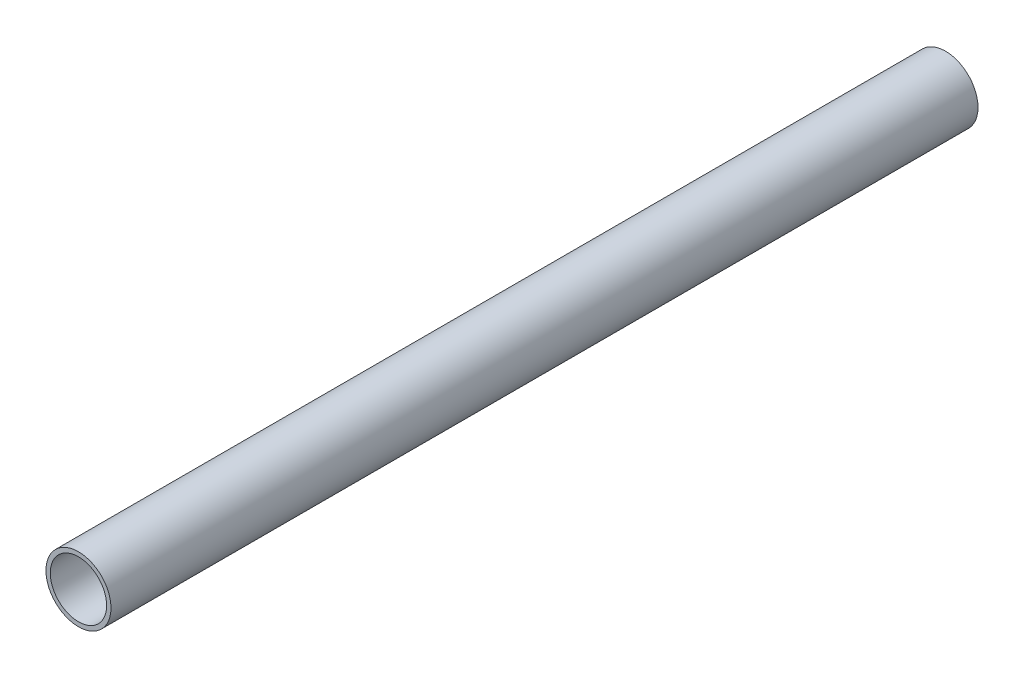
ISO-10303-21;
HEADER;
FILE_DESCRIPTION(('STEP AP214'),'2;1');
FILE_NAME('part.step','',(''),(''),'','','');
FILE_SCHEMA(('AUTOMOTIVE_DESIGN { 1 0 10303 214 1 1 1 1 }'));
ENDSEC;
DATA;
#1=APPLICATION_CONTEXT('core data for automotive mechanical design processes');
#2=APPLICATION_PROTOCOL_DEFINITION('international standard','automotive_design',2000,#1);
#3=PRODUCT_CONTEXT('',#1,'mechanical');
#4=PRODUCT('Part','Part','',(#3));
#5=PRODUCT_RELATED_PRODUCT_CATEGORY('part','',(#4));
#6=PRODUCT_DEFINITION_FORMATION('','',#4);
#7=PRODUCT_DEFINITION_CONTEXT('part definition',#1,'design');
#8=PRODUCT_DEFINITION('design','',#6,#7);
#9=PRODUCT_DEFINITION_SHAPE('','',#8);
#10=(LENGTH_UNIT() NAMED_UNIT(*) SI_UNIT(.MILLI.,.METRE.));
#11=(NAMED_UNIT(*) PLANE_ANGLE_UNIT() SI_UNIT($,.RADIAN.));
#12=(NAMED_UNIT(*) SI_UNIT($,.STERADIAN.) SOLID_ANGLE_UNIT());
#13=UNCERTAINTY_MEASURE_WITH_UNIT(LENGTH_MEASURE(1.E-05),#10,'distance_accuracy_value','');
#14=(GEOMETRIC_REPRESENTATION_CONTEXT(3) GLOBAL_UNCERTAINTY_ASSIGNED_CONTEXT((#13)) GLOBAL_UNIT_ASSIGNED_CONTEXT((#10,
#11,#12)) REPRESENTATION_CONTEXT('',''));
#15=CARTESIAN_POINT('',(0.,0.,0.));
#16=DIRECTION('',(0.,0.,1.));
#17=DIRECTION('',(1.,0.,0.));
#18=AXIS2_PLACEMENT_3D('',#15,#16,#17);
#19=CARTESIAN_POINT('',(0.,0.,-200.));
#20=DIRECTION('',(0.,0.,1.));
#21=DIRECTION('',(1.,0.,0.));
#22=AXIS2_PLACEMENT_3D('',#19,#20,#21);
#23=CYLINDRICAL_SURFACE('',#22,15.);
#24=CARTESIAN_POINT('',(0.,0.,-200.));
#25=DIRECTION('',(0.,0.,1.));
#26=DIRECTION('',(1.,0.,0.));
#27=AXIS2_PLACEMENT_3D('',#24,#25,#26);
#28=CIRCLE('',#27,15.);
#29=CARTESIAN_POINT('',(15.,0.,-200.));
#30=VERTEX_POINT('',#29);
#31=EDGE_CURVE('E10',#30,#30,#28,.T.);
#32=ORIENTED_EDGE('',*,*,#31,.T.);
#33=EDGE_LOOP('',(#32));
#34=FACE_BOUND('',#33,.T.);
#35=CARTESIAN_POINT('',(0.,0.,200.));
#36=DIRECTION('',(0.,0.,1.));
#37=DIRECTION('',(1.,0.,0.));
#38=AXIS2_PLACEMENT_3D('',#35,#36,#37);
#39=CIRCLE('',#38,15.);
#40=CARTESIAN_POINT('',(15.,0.,200.));
#41=VERTEX_POINT('',#40);
#42=EDGE_CURVE('E41',#41,#41,#39,.T.);
#43=ORIENTED_EDGE('',*,*,#42,.F.);
#44=EDGE_LOOP('',(#43));
#45=FACE_BOUND('',#44,.T.);
#46=ADVANCED_FACE('F31',(#34,#45),#23,.T.);
#47=CARTESIAN_POINT('',(0.,0.,-200.));
#48=DIRECTION('',(0.,0.,1.));
#49=DIRECTION('',(1.,0.,0.));
#50=AXIS2_PLACEMENT_3D('',#47,#48,#49);
#51=PLANE('',#50);
#52=CARTESIAN_POINT('',(0.,0.,-200.));
#53=DIRECTION('',(0.,0.,1.));
#54=DIRECTION('',(1.,0.,0.));
#55=AXIS2_PLACEMENT_3D('',#52,#53,#54);
#56=CIRCLE('',#55,13.);
#57=CARTESIAN_POINT('',(13.,0.,-200.));
#58=VERTEX_POINT('',#57);
#59=EDGE_CURVE('E37',#58,#58,#56,.T.);
#60=ORIENTED_EDGE('',*,*,#59,.T.);
#61=EDGE_LOOP('',(#60));
#62=FACE_BOUND('',#61,.T.);
#63=ORIENTED_EDGE('',*,*,#31,.F.);
#64=EDGE_LOOP('',(#63));
#65=FACE_BOUND('',#64,.T.);
#66=ADVANCED_FACE('F60',(#62,#65),#51,.F.);
#67=CARTESIAN_POINT('',(0.,0.,-200.));
#68=DIRECTION('',(0.,0.,1.));
#69=DIRECTION('',(1.,0.,0.));
#70=AXIS2_PLACEMENT_3D('',#67,#68,#69);
#71=CYLINDRICAL_SURFACE('',#70,13.);
#72=ORIENTED_EDGE('',*,*,#59,.F.);
#73=EDGE_LOOP('',(#72));
#74=FACE_BOUND('',#73,.T.);
#75=CARTESIAN_POINT('',(0.,0.,200.));
#76=DIRECTION('',(0.,0.,1.));
#77=DIRECTION('',(1.,0.,0.));
#78=AXIS2_PLACEMENT_3D('',#75,#76,#77);
#79=CIRCLE('',#78,13.);
#80=CARTESIAN_POINT('',(13.,0.,200.));
#81=VERTEX_POINT('',#80);
#82=EDGE_CURVE('E45',#81,#81,#79,.T.);
#83=ORIENTED_EDGE('',*,*,#82,.T.);
#84=EDGE_LOOP('',(#83));
#85=FACE_BOUND('',#84,.T.);
#86=ADVANCED_FACE('F51',(#74,#85),#71,.F.);
#87=CARTESIAN_POINT('',(0.,0.,200.));
#88=DIRECTION('',(0.,0.,1.));
#89=DIRECTION('',(1.,0.,0.));
#90=AXIS2_PLACEMENT_3D('',#87,#88,#89);
#91=PLANE('',#90);
#92=ORIENTED_EDGE('',*,*,#42,.T.);
#93=EDGE_LOOP('',(#92));
#94=FACE_BOUND('',#93,.T.);
#95=ORIENTED_EDGE('',*,*,#82,.F.);
#96=EDGE_LOOP('',(#95));
#97=FACE_BOUND('',#96,.T.);
#98=ADVANCED_FACE('F53',(#94,#97),#91,.T.);
#99=CLOSED_SHELL('',(#46,#66,#86,#98));
#100=MANIFOLD_SOLID_BREP('B2',#99);
#101=ADVANCED_BREP_SHAPE_REPRESENTATION('',(#18,#100),#14);
#102=SHAPE_DEFINITION_REPRESENTATION(#9,#101);
ENDSEC;
END-ISO-10303-21;
